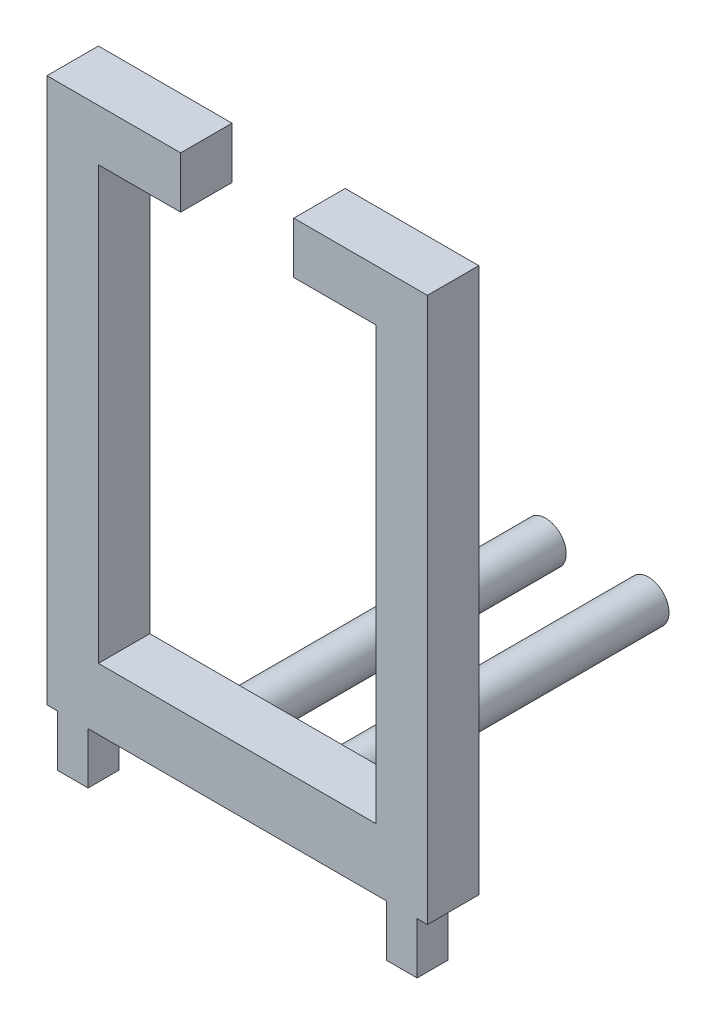
ISO-10303-21;
HEADER;
FILE_DESCRIPTION(('STEP AP214'),'2;1');
FILE_NAME('part.step','',(''),(''),'','','');
FILE_SCHEMA(('AUTOMOTIVE_DESIGN { 1 0 10303 214 1 1 1 1 }'));
ENDSEC;
DATA;
#1=APPLICATION_CONTEXT('core data for automotive mechanical design processes');
#2=APPLICATION_PROTOCOL_DEFINITION('international standard','automotive_design',2000,#1);
#3=PRODUCT_CONTEXT('',#1,'mechanical');
#4=PRODUCT('Part','Part','',(#3));
#5=PRODUCT_RELATED_PRODUCT_CATEGORY('part','',(#4));
#6=PRODUCT_DEFINITION_FORMATION('','',#4);
#7=PRODUCT_DEFINITION_CONTEXT('part definition',#1,'design');
#8=PRODUCT_DEFINITION('design','',#6,#7);
#9=PRODUCT_DEFINITION_SHAPE('','',#8);
#10=(LENGTH_UNIT() NAMED_UNIT(*) SI_UNIT(.MILLI.,.METRE.));
#11=(NAMED_UNIT(*) PLANE_ANGLE_UNIT() SI_UNIT($,.RADIAN.));
#12=(NAMED_UNIT(*) SI_UNIT($,.STERADIAN.) SOLID_ANGLE_UNIT());
#13=UNCERTAINTY_MEASURE_WITH_UNIT(LENGTH_MEASURE(1.E-05),#10,'distance_accuracy_value','');
#14=(GEOMETRIC_REPRESENTATION_CONTEXT(3) GLOBAL_UNCERTAINTY_ASSIGNED_CONTEXT((#13)) GLOBAL_UNIT_ASSIGNED_CONTEXT((#10,
#11,#12)) REPRESENTATION_CONTEXT('',''));
#15=CARTESIAN_POINT('',(0.,0.,0.));
#16=DIRECTION('',(0.,0.,1.));
#17=DIRECTION('',(1.,0.,0.));
#18=AXIS2_PLACEMENT_3D('',#15,#16,#17);
#19=CARTESIAN_POINT('',(-272.150432080713,58.,31.6586420954111));
#20=DIRECTION('',(1.,0.,0.));
#21=DIRECTION('',(0.,0.,-1.));
#22=AXIS2_PLACEMENT_3D('',#19,#20,#21);
#23=PLANE('',#22);
#24=DIRECTION('',(0.,0.,1.));
#25=VECTOR('',#24,1.);
#26=CARTESIAN_POINT('',(-272.150432080713,53.,31.6586420954111));
#27=LINE('',#26,#25);
#28=CARTESIAN_POINT('',(-272.150432080713,53.,26.6586420954111));
#29=VERTEX_POINT('',#28);
#30=CARTESIAN_POINT('',(-272.150432080713,53.,31.6586420954111));
#31=VERTEX_POINT('',#30);
#32=EDGE_CURVE('E197',#29,#31,#27,.T.);
#33=ORIENTED_EDGE('',*,*,#32,.F.);
#34=DIRECTION('',(0.,-1.,0.));
#35=VECTOR('',#34,1.);
#36=CARTESIAN_POINT('',(-272.150432080713,58.,26.6586420954111));
#37=LINE('',#36,#35);
#38=CARTESIAN_POINT('',(-272.150432080713,11.,26.6586420954111));
#39=VERTEX_POINT('',#38);
#40=EDGE_CURVE('E201',#29,#39,#37,.T.);
#41=ORIENTED_EDGE('',*,*,#40,.T.);
#42=DIRECTION('',(0.,0.,1.));
#43=VECTOR('',#42,1.);
#44=CARTESIAN_POINT('',(-272.150432080713,11.,31.6586420954111));
#45=LINE('',#44,#43);
#46=CARTESIAN_POINT('',(-272.150432080713,11.,31.6586420954111));
#47=VERTEX_POINT('',#46);
#48=EDGE_CURVE('E235',#39,#47,#45,.T.);
#49=ORIENTED_EDGE('',*,*,#48,.T.);
#50=DIRECTION('',(0.,-1.,0.));
#51=VECTOR('',#50,1.);
#52=CARTESIAN_POINT('',(-272.150432080713,58.,31.6586420954111));
#53=LINE('',#52,#51);
#54=EDGE_CURVE('E244',#31,#47,#53,.T.);
#55=ORIENTED_EDGE('',*,*,#54,.F.);
#56=EDGE_LOOP('',(#33,#41,#49,#55));
#57=FACE_BOUND('',#56,.T.);
#58=ADVANCED_FACE('F37',(#57),#23,.F.);
#59=CARTESIAN_POINT('',(-299.150432080713,58.,26.6586420954111));
#60=DIRECTION('',(-1.,0.,0.));
#61=DIRECTION('',(0.,0.,1.));
#62=AXIS2_PLACEMENT_3D('',#59,#60,#61);
#63=PLANE('',#62);
#64=DIRECTION('',(0.,0.,-1.));
#65=VECTOR('',#64,1.);
#66=CARTESIAN_POINT('',(-299.150432080713,53.,26.6586420954111));
#67=LINE('',#66,#65);
#68=CARTESIAN_POINT('',(-299.150432080713,53.,31.6586420954111));
#69=VERTEX_POINT('',#68);
#70=CARTESIAN_POINT('',(-299.150432080713,53.,26.6586420954111));
#71=VERTEX_POINT('',#70);
#72=EDGE_CURVE('E202',#69,#71,#67,.T.);
#73=ORIENTED_EDGE('',*,*,#72,.F.);
#74=DIRECTION('',(0.,-1.,0.));
#75=VECTOR('',#74,1.);
#76=CARTESIAN_POINT('',(-299.150432080713,58.,31.6586420954111));
#77=LINE('',#76,#75);
#78=CARTESIAN_POINT('',(-299.150432080713,11.,31.6586420954111));
#79=VERTEX_POINT('',#78);
#80=EDGE_CURVE('E52',#69,#79,#77,.T.);
#81=ORIENTED_EDGE('',*,*,#80,.T.);
#82=DIRECTION('',(0.,0.,-1.));
#83=VECTOR('',#82,1.);
#84=CARTESIAN_POINT('',(-299.150432080713,11.,26.6586420954111));
#85=LINE('',#84,#83);
#86=CARTESIAN_POINT('',(-299.150432080713,11.,26.6586420954111));
#87=VERTEX_POINT('',#86);
#88=EDGE_CURVE('E223',#79,#87,#85,.T.);
#89=ORIENTED_EDGE('',*,*,#88,.T.);
#90=DIRECTION('',(0.,-1.,0.));
#91=VECTOR('',#90,1.);
#92=CARTESIAN_POINT('',(-299.150432080713,58.,26.6586420954111));
#93=LINE('',#92,#91);
#94=EDGE_CURVE('E60',#71,#87,#93,.T.);
#95=ORIENTED_EDGE('',*,*,#94,.F.);
#96=EDGE_LOOP('',(#73,#81,#89,#95));
#97=FACE_BOUND('',#96,.T.);
#98=ADVANCED_FACE('F365',(#97),#63,.F.);
#99=CARTESIAN_POINT('',(0.,11.,0.));
#100=DIRECTION('',(0.,-1.,0.));
#101=DIRECTION('',(0.,0.,-1.));
#102=AXIS2_PLACEMENT_3D('',#99,#100,#101);
#103=PLANE('',#102);
#104=ORIENTED_EDGE('',*,*,#88,.F.);
#105=DIRECTION('',(1.,0.,0.));
#106=VECTOR('',#105,1.);
#107=CARTESIAN_POINT('',(-299.150432080713,11.,31.6586420954111));
#108=LINE('',#107,#106);
#109=EDGE_CURVE('E293',#79,#47,#108,.T.);
#110=ORIENTED_EDGE('',*,*,#109,.T.);
#111=ORIENTED_EDGE('',*,*,#48,.F.);
#112=DIRECTION('',(-1.,0.,0.));
#113=VECTOR('',#112,1.);
#114=CARTESIAN_POINT('',(-304.150432080713,11.,26.6586420954111));
#115=LINE('',#114,#113);
#116=EDGE_CURVE('E296',#39,#87,#115,.T.);
#117=ORIENTED_EDGE('',*,*,#116,.T.);
#118=EDGE_LOOP('',(#104,#110,#111,#117));
#119=FACE_BOUND('',#118,.T.);
#120=ADVANCED_FACE('F371',(#119),#103,.F.);
#121=CARTESIAN_POINT('',(0.,5.,0.));
#122=DIRECTION('',(0.,-1.,0.));
#123=DIRECTION('',(0.,0.,-1.));
#124=AXIS2_PLACEMENT_3D('',#121,#122,#123);
#125=PLANE('',#124);
#126=DIRECTION('',(0.,0.,1.));
#127=VECTOR('',#126,1.);
#128=CARTESIAN_POINT('',(-304.150432080713,5.,31.6586420954111));
#129=LINE('',#128,#127);
#130=CARTESIAN_POINT('',(-304.150432080713,5.,26.6586420954111));
#131=VERTEX_POINT('',#130);
#132=CARTESIAN_POINT('',(-304.150432080713,5.,31.6586420954111));
#133=VERTEX_POINT('',#132);
#134=EDGE_CURVE('E291',#131,#133,#129,.T.);
#135=ORIENTED_EDGE('',*,*,#134,.F.);
#136=DIRECTION('',(-1.,0.,0.));
#137=VECTOR('',#136,1.);
#138=CARTESIAN_POINT('',(-304.150432080713,5.,26.6586420954111));
#139=LINE('',#138,#137);
#140=CARTESIAN_POINT('',(-267.150432080713,5.,26.6586420954111));
#141=VERTEX_POINT('',#140);
#142=EDGE_CURVE('E297',#141,#131,#139,.T.);
#143=ORIENTED_EDGE('',*,*,#142,.F.);
#144=DIRECTION('',(0.,0.,-1.));
#145=VECTOR('',#144,1.);
#146=CARTESIAN_POINT('',(-267.150432080713,5.,26.6586420954111));
#147=LINE('',#146,#145);
#148=CARTESIAN_POINT('',(-267.150432080713,5.,31.6586420954111));
#149=VERTEX_POINT('',#148);
#150=EDGE_CURVE('E285',#149,#141,#147,.T.);
#151=ORIENTED_EDGE('',*,*,#150,.F.);
#152=DIRECTION('',(1.,0.,0.));
#153=VECTOR('',#152,1.);
#154=CARTESIAN_POINT('',(-299.150432080713,5.,31.6586420954111));
#155=LINE('',#154,#153);
#156=CARTESIAN_POINT('',(-268.150432080713,5.,31.6586420954111));
#157=VERTEX_POINT('',#156);
#158=EDGE_CURVE('E302',#157,#149,#155,.T.);
#159=ORIENTED_EDGE('',*,*,#158,.F.);
#160=DIRECTION('',(0.,0.,-1.));
#161=VECTOR('',#160,1.);
#162=CARTESIAN_POINT('',(-268.150432080713,5.,28.6586420954111));
#163=LINE('',#162,#161);
#164=CARTESIAN_POINT('',(-268.150432080713,5.,28.6586420954111));
#165=VERTEX_POINT('',#164);
#166=EDGE_CURVE('E259',#157,#165,#163,.T.);
#167=ORIENTED_EDGE('',*,*,#166,.T.);
#168=DIRECTION('',(-1.,0.,0.));
#169=VECTOR('',#168,1.);
#170=CARTESIAN_POINT('',(-271.150432080713,5.,28.6586420954111));
#171=LINE('',#170,#169);
#172=CARTESIAN_POINT('',(-271.150432080713,5.,28.6586420954111));
#173=VERTEX_POINT('',#172);
#174=EDGE_CURVE('E263',#165,#173,#171,.T.);
#175=ORIENTED_EDGE('',*,*,#174,.T.);
#176=DIRECTION('',(0.,0.,1.));
#177=VECTOR('',#176,1.);
#178=CARTESIAN_POINT('',(-271.150432080713,5.,31.6586420954111));
#179=LINE('',#178,#177);
#180=CARTESIAN_POINT('',(-271.150432080713,5.,31.6586420954111));
#181=VERTEX_POINT('',#180);
#182=EDGE_CURVE('E256',#173,#181,#179,.T.);
#183=ORIENTED_EDGE('',*,*,#182,.T.);
#184=CARTESIAN_POINT('',(-300.150432080713,5.,31.6586420954111));
#185=VERTEX_POINT('',#184);
#186=EDGE_CURVE('E306',#185,#181,#155,.T.);
#187=ORIENTED_EDGE('',*,*,#186,.F.);
#188=DIRECTION('',(0.,0.,-1.));
#189=VECTOR('',#188,1.);
#190=CARTESIAN_POINT('',(-300.150432080713,5.,28.6586420954111));
#191=LINE('',#190,#189);
#192=CARTESIAN_POINT('',(-300.150432080713,5.,28.6586420954111));
#193=VERTEX_POINT('',#192);
#194=EDGE_CURVE('E314',#185,#193,#191,.T.);
#195=ORIENTED_EDGE('',*,*,#194,.T.);
#196=DIRECTION('',(-1.,0.,0.));
#197=VECTOR('',#196,1.);
#198=CARTESIAN_POINT('',(-303.150432080713,5.,28.6586420954111));
#199=LINE('',#198,#197);
#200=CARTESIAN_POINT('',(-303.150432080713,5.,28.6586420954111));
#201=VERTEX_POINT('',#200);
#202=EDGE_CURVE('E317',#193,#201,#199,.T.);
#203=ORIENTED_EDGE('',*,*,#202,.T.);
#204=DIRECTION('',(0.,0.,1.));
#205=VECTOR('',#204,1.);
#206=CARTESIAN_POINT('',(-303.150432080713,5.,31.6586420954111));
#207=LINE('',#206,#205);
#208=CARTESIAN_POINT('',(-303.150432080713,5.,31.6586420954111));
#209=VERTEX_POINT('',#208);
#210=EDGE_CURVE('E321',#201,#209,#207,.T.);
#211=ORIENTED_EDGE('',*,*,#210,.T.);
#212=EDGE_CURVE('E303',#133,#209,#155,.T.);
#213=ORIENTED_EDGE('',*,*,#212,.F.);
#214=EDGE_LOOP('',(#135,#143,#151,#159,#167,#175,#183,#187,#195,#203,#211,#213));
#215=FACE_BOUND('',#214,.T.);
#216=ADVANCED_FACE('F407',(#215),#125,.T.);
#217=CARTESIAN_POINT('',(-300.150432080713,5.,31.6586420954111));
#218=DIRECTION('',(0.,0.,-1.));
#219=DIRECTION('',(-1.,0.,0.));
#220=AXIS2_PLACEMENT_3D('',#217,#218,#219);
#221=PLANE('',#220);
#222=DIRECTION('',(0.,1.,0.));
#223=VECTOR('',#222,1.);
#224=CARTESIAN_POINT('',(-267.150432080713,5.,31.6586420954111));
#225=LINE('',#224,#223);
#226=CARTESIAN_POINT('',(-267.150432080713,58.,31.6586420954111));
#227=VERTEX_POINT('',#226);
#228=EDGE_CURVE('E288',#149,#227,#225,.T.);
#229=ORIENTED_EDGE('',*,*,#228,.T.);
#230=DIRECTION('',(1.,0.,0.));
#231=VECTOR('',#230,1.);
#232=CARTESIAN_POINT('',(-267.150432080713,58.,31.6586420954111));
#233=LINE('',#232,#231);
#234=CARTESIAN_POINT('',(-280.150432080713,58.,31.6586420954111));
#235=VERTEX_POINT('',#234);
#236=EDGE_CURVE('E238',#235,#227,#233,.T.);
#237=ORIENTED_EDGE('',*,*,#236,.F.);
#238=DIRECTION('',(0.,1.,0.));
#239=VECTOR('',#238,1.);
#240=CARTESIAN_POINT('',(-280.150432080713,58.,31.6586420954111));
#241=LINE('',#240,#239);
#242=CARTESIAN_POINT('',(-280.150432080713,53.,31.6586420954111));
#243=VERTEX_POINT('',#242);
#244=EDGE_CURVE('E188',#243,#235,#241,.T.);
#245=ORIENTED_EDGE('',*,*,#244,.F.);
#246=DIRECTION('',(1.,0.,0.));
#247=VECTOR('',#246,1.);
#248=CARTESIAN_POINT('',(-280.150432080713,53.,31.6586420954111));
#249=LINE('',#248,#247);
#250=EDGE_CURVE('E184',#243,#31,#249,.T.);
#251=ORIENTED_EDGE('',*,*,#250,.T.);
#252=ORIENTED_EDGE('',*,*,#54,.T.);
#253=ORIENTED_EDGE('',*,*,#109,.F.);
#254=ORIENTED_EDGE('',*,*,#80,.F.);
#255=DIRECTION('',(-1.,0.,0.));
#256=VECTOR('',#255,1.);
#257=CARTESIAN_POINT('',(-291.150432080713,53.,31.6586420954111));
#258=LINE('',#257,#256);
#259=CARTESIAN_POINT('',(-291.150432080713,53.,31.6586420954111));
#260=VERTEX_POINT('',#259);
#261=EDGE_CURVE('E221',#260,#69,#258,.T.);
#262=ORIENTED_EDGE('',*,*,#261,.F.);
#263=DIRECTION('',(0.,-1.,0.));
#264=VECTOR('',#263,1.);
#265=CARTESIAN_POINT('',(-291.150432080713,53.,31.6586420954111));
#266=LINE('',#265,#264);
#267=CARTESIAN_POINT('',(-291.150432080713,58.,31.6586420954111));
#268=VERTEX_POINT('',#267);
#269=EDGE_CURVE('E204',#268,#260,#266,.T.);
#270=ORIENTED_EDGE('',*,*,#269,.F.);
#271=DIRECTION('',(1.,0.,0.));
#272=VECTOR('',#271,1.);
#273=CARTESIAN_POINT('',(-299.150432080713,58.,31.6586420954111));
#274=LINE('',#273,#272);
#275=CARTESIAN_POINT('',(-304.150432080713,58.,31.6586420954111));
#276=VERTEX_POINT('',#275);
#277=EDGE_CURVE('E227',#276,#268,#274,.T.);
#278=ORIENTED_EDGE('',*,*,#277,.F.);
#279=DIRECTION('',(0.,-1.,0.));
#280=VECTOR('',#279,1.);
#281=CARTESIAN_POINT('',(-304.150432080713,11.,31.6586420954111));
#282=LINE('',#281,#280);
#283=EDGE_CURVE('E310',#276,#133,#282,.T.);
#284=ORIENTED_EDGE('',*,*,#283,.T.);
#285=ORIENTED_EDGE('',*,*,#212,.T.);
#286=DIRECTION('',(0.,-1.,0.));
#287=VECTOR('',#286,1.);
#288=CARTESIAN_POINT('',(-303.150432080713,5.,31.6586420954111));
#289=LINE('',#288,#287);
#290=CARTESIAN_POINT('',(-303.150432080713,0.,31.6586420954111));
#291=VERTEX_POINT('',#290);
#292=EDGE_CURVE('E324',#209,#291,#289,.T.);
#293=ORIENTED_EDGE('',*,*,#292,.T.);
#294=DIRECTION('',(1.,0.,0.));
#295=VECTOR('',#294,1.);
#296=CARTESIAN_POINT('',(-300.150432080713,0.,31.6586420954111));
#297=LINE('',#296,#295);
#298=CARTESIAN_POINT('',(-300.150432080713,0.,31.6586420954111));
#299=VERTEX_POINT('',#298);
#300=EDGE_CURVE('E313',#291,#299,#297,.T.);
#301=ORIENTED_EDGE('',*,*,#300,.T.);
#302=DIRECTION('',(0.,-1.,0.));
#303=VECTOR('',#302,1.);
#304=CARTESIAN_POINT('',(-300.150432080713,5.,31.6586420954111));
#305=LINE('',#304,#303);
#306=EDGE_CURVE('E340',#185,#299,#305,.T.);
#307=ORIENTED_EDGE('',*,*,#306,.F.);
#308=ORIENTED_EDGE('',*,*,#186,.T.);
#309=DIRECTION('',(0.,-1.,0.));
#310=VECTOR('',#309,1.);
#311=CARTESIAN_POINT('',(-271.150432080713,5.,31.6586420954111));
#312=LINE('',#311,#310);
#313=CARTESIAN_POINT('',(-271.150432080713,0.,31.6586420954111));
#314=VERTEX_POINT('',#313);
#315=EDGE_CURVE('E282',#181,#314,#312,.T.);
#316=ORIENTED_EDGE('',*,*,#315,.T.);
#317=DIRECTION('',(1.,0.,0.));
#318=VECTOR('',#317,1.);
#319=CARTESIAN_POINT('',(-268.150432080713,0.,31.6586420954111));
#320=LINE('',#319,#318);
#321=CARTESIAN_POINT('',(-268.150432080713,0.,31.6586420954111));
#322=VERTEX_POINT('',#321);
#323=EDGE_CURVE('E269',#314,#322,#320,.T.);
#324=ORIENTED_EDGE('',*,*,#323,.T.);
#325=DIRECTION('',(0.,-1.,0.));
#326=VECTOR('',#325,1.);
#327=CARTESIAN_POINT('',(-268.150432080713,5.,31.6586420954111));
#328=LINE('',#327,#326);
#329=EDGE_CURVE('E279',#157,#322,#328,.T.);
#330=ORIENTED_EDGE('',*,*,#329,.F.);
#331=ORIENTED_EDGE('',*,*,#158,.T.);
#332=EDGE_LOOP('',(#229,#237,#245,#251,#252,#253,#254,#262,#270,#278,#284,#285,#293,#301,#307,
#308,#316,#324,#330,#331));
#333=FACE_BOUND('',#332,.T.);
#334=ADVANCED_FACE('F39',(#333),#221,.F.);
#335=CARTESIAN_POINT('',(-300.150432080713,5.,28.6586420954111));
#336=DIRECTION('',(-1.,0.,0.));
#337=DIRECTION('',(0.,0.,1.));
#338=AXIS2_PLACEMENT_3D('',#335,#336,#337);
#339=PLANE('',#338);
#340=DIRECTION('',(0.,0.,-1.));
#341=VECTOR('',#340,1.);
#342=CARTESIAN_POINT('',(-300.150432080713,0.,28.6586420954111));
#343=LINE('',#342,#341);
#344=CARTESIAN_POINT('',(-300.150432080713,0.,28.6586420954111));
#345=VERTEX_POINT('',#344);
#346=EDGE_CURVE('E327',#299,#345,#343,.T.);
#347=ORIENTED_EDGE('',*,*,#346,.T.);
#348=DIRECTION('',(0.,-1.,0.));
#349=VECTOR('',#348,1.);
#350=CARTESIAN_POINT('',(-300.150432080713,5.,28.6586420954111));
#351=LINE('',#350,#349);
#352=EDGE_CURVE('E337',#193,#345,#351,.T.);
#353=ORIENTED_EDGE('',*,*,#352,.F.);
#354=ORIENTED_EDGE('',*,*,#194,.F.);
#355=ORIENTED_EDGE('',*,*,#306,.T.);
#356=EDGE_LOOP('',(#347,#353,#354,#355));
#357=FACE_BOUND('',#356,.T.);
#358=ADVANCED_FACE('F414',(#357),#339,.F.);
#359=CARTESIAN_POINT('',(-303.150432080713,5.,28.6586420954111));
#360=DIRECTION('',(0.,0.,1.));
#361=DIRECTION('',(1.,0.,0.));
#362=AXIS2_PLACEMENT_3D('',#359,#360,#361);
#363=PLANE('',#362);
#364=DIRECTION('',(-1.,0.,0.));
#365=VECTOR('',#364,1.);
#366=CARTESIAN_POINT('',(-303.150432080713,0.,28.6586420954111));
#367=LINE('',#366,#365);
#368=CARTESIAN_POINT('',(-303.150432080713,0.,28.6586420954111));
#369=VERTEX_POINT('',#368);
#370=EDGE_CURVE('E329',#345,#369,#367,.T.);
#371=ORIENTED_EDGE('',*,*,#370,.T.);
#372=DIRECTION('',(0.,-1.,0.));
#373=VECTOR('',#372,1.);
#374=CARTESIAN_POINT('',(-303.150432080713,5.,28.6586420954111));
#375=LINE('',#374,#373);
#376=EDGE_CURVE('E334',#201,#369,#375,.T.);
#377=ORIENTED_EDGE('',*,*,#376,.F.);
#378=ORIENTED_EDGE('',*,*,#202,.F.);
#379=ORIENTED_EDGE('',*,*,#352,.T.);
#380=EDGE_LOOP('',(#371,#377,#378,#379));
#381=FACE_BOUND('',#380,.T.);
#382=ADVANCED_FACE('F454',(#381),#363,.F.);
#383=CARTESIAN_POINT('',(-303.150432080713,5.,31.6586420954111));
#384=DIRECTION('',(1.,0.,0.));
#385=DIRECTION('',(0.,0.,-1.));
#386=AXIS2_PLACEMENT_3D('',#383,#384,#385);
#387=PLANE('',#386);
#388=DIRECTION('',(0.,0.,1.));
#389=VECTOR('',#388,1.);
#390=CARTESIAN_POINT('',(-303.150432080713,0.,31.6586420954111));
#391=LINE('',#390,#389);
#392=EDGE_CURVE('E318',#369,#291,#391,.T.);
#393=ORIENTED_EDGE('',*,*,#392,.T.);
#394=ORIENTED_EDGE('',*,*,#292,.F.);
#395=ORIENTED_EDGE('',*,*,#210,.F.);
#396=ORIENTED_EDGE('',*,*,#376,.T.);
#397=EDGE_LOOP('',(#393,#394,#395,#396));
#398=FACE_BOUND('',#397,.T.);
#399=ADVANCED_FACE('F458',(#398),#387,.F.);
#400=CARTESIAN_POINT('',(0.,0.,0.));
#401=DIRECTION('',(0.,-1.,0.));
#402=DIRECTION('',(0.,0.,-1.));
#403=AXIS2_PLACEMENT_3D('',#400,#401,#402);
#404=PLANE('',#403);
#405=ORIENTED_EDGE('',*,*,#300,.F.);
#406=ORIENTED_EDGE('',*,*,#392,.F.);
#407=ORIENTED_EDGE('',*,*,#370,.F.);
#408=ORIENTED_EDGE('',*,*,#346,.F.);
#409=EDGE_LOOP('',(#405,#406,#407,#408));
#410=FACE_BOUND('',#409,.T.);
#411=ADVANCED_FACE('F359',(#410),#404,.T.);
#412=CARTESIAN_POINT('',(-304.150432080713,11.,31.6586420954111));
#413=DIRECTION('',(1.,0.,0.));
#414=DIRECTION('',(0.,0.,-1.));
#415=AXIS2_PLACEMENT_3D('',#412,#413,#414);
#416=PLANE('',#415);
#417=ORIENTED_EDGE('',*,*,#134,.T.);
#418=ORIENTED_EDGE('',*,*,#283,.F.);
#419=DIRECTION('',(0.,0.,1.));
#420=VECTOR('',#419,1.);
#421=CARTESIAN_POINT('',(-304.150432080713,58.,31.6586420954111));
#422=LINE('',#421,#420);
#423=CARTESIAN_POINT('',(-304.150432080713,58.,26.6586420954111));
#424=VERTEX_POINT('',#423);
#425=EDGE_CURVE('E224',#424,#276,#422,.T.);
#426=ORIENTED_EDGE('',*,*,#425,.F.);
#427=DIRECTION('',(0.,-1.,0.));
#428=VECTOR('',#427,1.);
#429=CARTESIAN_POINT('',(-304.150432080713,11.,26.6586420954111));
#430=LINE('',#429,#428);
#431=EDGE_CURVE('E299',#424,#131,#430,.T.);
#432=ORIENTED_EDGE('',*,*,#431,.T.);
#433=EDGE_LOOP('',(#417,#418,#426,#432));
#434=FACE_BOUND('',#433,.T.);
#435=ADVANCED_FACE('F349',(#434),#416,.F.);
#436=CARTESIAN_POINT('',(-304.150432080713,11.,26.6586420954111));
#437=DIRECTION('',(0.,0.,1.));
#438=DIRECTION('',(1.,0.,0.));
#439=AXIS2_PLACEMENT_3D('',#436,#437,#438);
#440=PLANE('',#439);
#441=CARTESIAN_POINT('',(-290.650393331086,7.98031511318751,26.6586420954111));
#442=DIRECTION('',(0.,0.,1.));
#443=DIRECTION('',(1.,0.,0.));
#444=AXIS2_PLACEMENT_3D('',#441,#442,#443);
#445=CIRCLE('',#444,2.);
#446=CARTESIAN_POINT('',(-288.650393331086,7.98031511318751,26.6586420954111));
#447=VERTEX_POINT('',#446);
#448=EDGE_CURVE('E11',#447,#447,#445,.F.);
#449=ORIENTED_EDGE('',*,*,#448,.F.);
#450=EDGE_LOOP('',(#449));
#451=FACE_BOUND('',#450,.T.);
#452=CARTESIAN_POINT('',(-280.65047083034,8.01968488681249,26.6586420954111));
#453=DIRECTION('',(0.,0.,1.));
#454=DIRECTION('',(1.,0.,0.));
#455=AXIS2_PLACEMENT_3D('',#452,#453,#454);
#456=CIRCLE('',#455,2.);
#457=CARTESIAN_POINT('',(-278.65047083034,8.01968488681249,26.6586420954111));
#458=VERTEX_POINT('',#457);
#459=EDGE_CURVE('E45',#458,#458,#456,.F.);
#460=ORIENTED_EDGE('',*,*,#459,.F.);
#461=EDGE_LOOP('',(#460));
#462=FACE_BOUND('',#461,.T.);
#463=ORIENTED_EDGE('',*,*,#142,.T.);
#464=ORIENTED_EDGE('',*,*,#431,.F.);
#465=DIRECTION('',(-1.,0.,0.));
#466=VECTOR('',#465,1.);
#467=CARTESIAN_POINT('',(-304.150432080713,58.,26.6586420954111));
#468=LINE('',#467,#466);
#469=CARTESIAN_POINT('',(-291.150432080713,58.,26.6586420954111));
#470=VERTEX_POINT('',#469);
#471=EDGE_CURVE('E229',#470,#424,#468,.T.);
#472=ORIENTED_EDGE('',*,*,#471,.F.);
#473=DIRECTION('',(0.,1.,0.));
#474=VECTOR('',#473,1.);
#475=CARTESIAN_POINT('',(-291.150432080713,58.,26.6586420954111));
#476=LINE('',#475,#474);
#477=CARTESIAN_POINT('',(-291.150432080713,53.,26.6586420954111));
#478=VERTEX_POINT('',#477);
#479=EDGE_CURVE('E213',#478,#470,#476,.T.);
#480=ORIENTED_EDGE('',*,*,#479,.F.);
#481=DIRECTION('',(-1.,0.,0.));
#482=VECTOR('',#481,1.);
#483=CARTESIAN_POINT('',(-291.150432080713,53.,26.6586420954111));
#484=LINE('',#483,#482);
#485=EDGE_CURVE('E218',#478,#71,#484,.T.);
#486=ORIENTED_EDGE('',*,*,#485,.T.);
#487=ORIENTED_EDGE('',*,*,#94,.T.);
#488=ORIENTED_EDGE('',*,*,#116,.F.);
#489=ORIENTED_EDGE('',*,*,#40,.F.);
#490=DIRECTION('',(1.,0.,0.));
#491=VECTOR('',#490,1.);
#492=CARTESIAN_POINT('',(-280.150432080713,53.,26.6586420954111));
#493=LINE('',#492,#491);
#494=CARTESIAN_POINT('',(-280.150432080713,53.,26.6586420954111));
#495=VERTEX_POINT('',#494);
#496=EDGE_CURVE('E181',#495,#29,#493,.T.);
#497=ORIENTED_EDGE('',*,*,#496,.F.);
#498=DIRECTION('',(0.,-1.,0.));
#499=VECTOR('',#498,1.);
#500=CARTESIAN_POINT('',(-280.150432080713,53.,26.6586420954111));
#501=LINE('',#500,#499);
#502=CARTESIAN_POINT('',(-280.150432080713,58.,26.6586420954111));
#503=VERTEX_POINT('',#502);
#504=EDGE_CURVE('E189',#503,#495,#501,.T.);
#505=ORIENTED_EDGE('',*,*,#504,.F.);
#506=DIRECTION('',(-1.,0.,0.));
#507=VECTOR('',#506,1.);
#508=CARTESIAN_POINT('',(-272.150432080713,58.,26.6586420954111));
#509=LINE('',#508,#507);
#510=CARTESIAN_POINT('',(-267.150432080713,58.,26.6586420954111));
#511=VERTEX_POINT('',#510);
#512=EDGE_CURVE('E236',#511,#503,#509,.T.);
#513=ORIENTED_EDGE('',*,*,#512,.F.);
#514=DIRECTION('',(0.,1.,0.));
#515=VECTOR('',#514,1.);
#516=CARTESIAN_POINT('',(-267.150432080713,5.,26.6586420954111));
#517=LINE('',#516,#515);
#518=EDGE_CURVE('E289',#141,#511,#517,.T.);
#519=ORIENTED_EDGE('',*,*,#518,.F.);
#520=EDGE_LOOP('',(#463,#464,#472,#480,#486,#487,#488,#489,#497,#505,#513,#519));
#521=FACE_BOUND('',#520,.T.);
#522=ADVANCED_FACE('F200',(#451,#462,#521),#440,.F.);
#523=CARTESIAN_POINT('',(-267.150432080713,5.,26.6586420954111));
#524=DIRECTION('',(1.,0.,0.));
#525=DIRECTION('',(0.,0.,-1.));
#526=AXIS2_PLACEMENT_3D('',#523,#524,#525);
#527=PLANE('',#526);
#528=ORIENTED_EDGE('',*,*,#518,.T.);
#529=DIRECTION('',(0.,0.,-1.));
#530=VECTOR('',#529,1.);
#531=CARTESIAN_POINT('',(-267.150432080713,58.,26.6586420954111));
#532=LINE('',#531,#530);
#533=EDGE_CURVE('E241',#227,#511,#532,.T.);
#534=ORIENTED_EDGE('',*,*,#533,.F.);
#535=ORIENTED_EDGE('',*,*,#228,.F.);
#536=ORIENTED_EDGE('',*,*,#150,.T.);
#537=EDGE_LOOP('',(#528,#534,#535,#536));
#538=FACE_BOUND('',#537,.T.);
#539=ADVANCED_FACE('F348',(#538),#527,.T.);
#540=CARTESIAN_POINT('',(-271.150432080713,5.,31.6586420954111));
#541=DIRECTION('',(1.,0.,0.));
#542=DIRECTION('',(0.,0.,-1.));
#543=AXIS2_PLACEMENT_3D('',#540,#541,#542);
#544=PLANE('',#543);
#545=DIRECTION('',(0.,0.,1.));
#546=VECTOR('',#545,1.);
#547=CARTESIAN_POINT('',(-271.150432080713,0.,31.6586420954111));
#548=LINE('',#547,#546);
#549=CARTESIAN_POINT('',(-271.150432080713,0.,28.6586420954111));
#550=VERTEX_POINT('',#549);
#551=EDGE_CURVE('E255',#550,#314,#548,.T.);
#552=ORIENTED_EDGE('',*,*,#551,.T.);
#553=ORIENTED_EDGE('',*,*,#315,.F.);
#554=ORIENTED_EDGE('',*,*,#182,.F.);
#555=DIRECTION('',(0.,-1.,0.));
#556=VECTOR('',#555,1.);
#557=CARTESIAN_POINT('',(-271.150432080713,5.,28.6586420954111));
#558=LINE('',#557,#556);
#559=EDGE_CURVE('E266',#173,#550,#558,.T.);
#560=ORIENTED_EDGE('',*,*,#559,.T.);
#561=EDGE_LOOP('',(#552,#553,#554,#560));
#562=FACE_BOUND('',#561,.T.);
#563=ADVANCED_FACE('F356',(#562),#544,.F.);
#564=CARTESIAN_POINT('',(-268.150432080713,5.,28.6586420954111));
#565=DIRECTION('',(-1.,0.,0.));
#566=DIRECTION('',(0.,0.,1.));
#567=AXIS2_PLACEMENT_3D('',#564,#565,#566);
#568=PLANE('',#567);
#569=DIRECTION('',(0.,0.,-1.));
#570=VECTOR('',#569,1.);
#571=CARTESIAN_POINT('',(-268.150432080713,0.,28.6586420954111));
#572=LINE('',#571,#570);
#573=CARTESIAN_POINT('',(-268.150432080713,0.,28.6586420954111));
#574=VERTEX_POINT('',#573);
#575=EDGE_CURVE('E271',#322,#574,#572,.T.);
#576=ORIENTED_EDGE('',*,*,#575,.T.);
#577=DIRECTION('',(0.,-1.,0.));
#578=VECTOR('',#577,1.);
#579=CARTESIAN_POINT('',(-268.150432080713,5.,28.6586420954111));
#580=LINE('',#579,#578);
#581=EDGE_CURVE('E276',#165,#574,#580,.T.);
#582=ORIENTED_EDGE('',*,*,#581,.F.);
#583=ORIENTED_EDGE('',*,*,#166,.F.);
#584=ORIENTED_EDGE('',*,*,#329,.T.);
#585=EDGE_LOOP('',(#576,#582,#583,#584));
#586=FACE_BOUND('',#585,.T.);
#587=ADVANCED_FACE('F398',(#586),#568,.F.);
#588=CARTESIAN_POINT('',(-271.150432080713,5.,28.6586420954111));
#589=DIRECTION('',(0.,0.,1.));
#590=DIRECTION('',(1.,0.,0.));
#591=AXIS2_PLACEMENT_3D('',#588,#589,#590);
#592=PLANE('',#591);
#593=DIRECTION('',(-1.,0.,0.));
#594=VECTOR('',#593,1.);
#595=CARTESIAN_POINT('',(-271.150432080713,0.,28.6586420954111));
#596=LINE('',#595,#594);
#597=EDGE_CURVE('E260',#574,#550,#596,.T.);
#598=ORIENTED_EDGE('',*,*,#597,.T.);
#599=ORIENTED_EDGE('',*,*,#559,.F.);
#600=ORIENTED_EDGE('',*,*,#174,.F.);
#601=ORIENTED_EDGE('',*,*,#581,.T.);
#602=EDGE_LOOP('',(#598,#599,#600,#601));
#603=FACE_BOUND('',#602,.T.);
#604=ADVANCED_FACE('F394',(#603),#592,.F.);
#605=CARTESIAN_POINT('',(0.,0.,0.));
#606=DIRECTION('',(0.,-1.,0.));
#607=DIRECTION('',(0.,0.,-1.));
#608=AXIS2_PLACEMENT_3D('',#605,#606,#607);
#609=PLANE('',#608);
#610=ORIENTED_EDGE('',*,*,#551,.F.);
#611=ORIENTED_EDGE('',*,*,#597,.F.);
#612=ORIENTED_EDGE('',*,*,#575,.F.);
#613=ORIENTED_EDGE('',*,*,#323,.F.);
#614=EDGE_LOOP('',(#610,#611,#612,#613));
#615=FACE_BOUND('',#614,.T.);
#616=ADVANCED_FACE('F390',(#615),#609,.T.);
#617=CARTESIAN_POINT('',(-280.65047083034,8.01968488681249,-3.34135790458889));
#618=DIRECTION('',(0.,0.,1.));
#619=DIRECTION('',(1.,0.,0.));
#620=AXIS2_PLACEMENT_3D('',#617,#618,#619);
#621=CYLINDRICAL_SURFACE('',#620,2.);
#622=CARTESIAN_POINT('',(-280.65047083034,8.01968488681249,-3.34135790458889));
#623=DIRECTION('',(0.,0.,-1.));
#624=DIRECTION('',(-1.,0.,0.));
#625=AXIS2_PLACEMENT_3D('',#622,#623,#624);
#626=CIRCLE('',#625,2.);
#627=CARTESIAN_POINT('',(-282.65047083034,8.01968488681249,-3.34135790458889));
#628=VERTEX_POINT('',#627);
#629=EDGE_CURVE('E252',#628,#628,#626,.T.);
#630=ORIENTED_EDGE('',*,*,#629,.F.);
#631=EDGE_LOOP('',(#630));
#632=FACE_BOUND('',#631,.T.);
#633=ORIENTED_EDGE('',*,*,#459,.T.);
#634=EDGE_LOOP('',(#633));
#635=FACE_BOUND('',#634,.T.);
#636=ADVANCED_FACE('F345',(#632,#635),#621,.T.);
#637=CARTESIAN_POINT('',(-280.65047083034,8.01968488681249,-3.34135790458889));
#638=DIRECTION('',(0.,0.,-1.));
#639=DIRECTION('',(-1.,0.,0.));
#640=AXIS2_PLACEMENT_3D('',#637,#638,#639);
#641=PLANE('',#640);
#642=ORIENTED_EDGE('',*,*,#629,.T.);
#643=EDGE_LOOP('',(#642));
#644=FACE_BOUND('',#643,.T.);
#645=ADVANCED_FACE('F383',(#644),#641,.T.);
#646=CARTESIAN_POINT('',(-290.650393331086,7.98031511318751,-3.34135790458889));
#647=DIRECTION('',(0.,0.,1.));
#648=DIRECTION('',(1.,0.,0.));
#649=AXIS2_PLACEMENT_3D('',#646,#647,#648);
#650=CYLINDRICAL_SURFACE('',#649,2.);
#651=CARTESIAN_POINT('',(-290.650393331086,7.98031511318751,-3.34135790458889));
#652=DIRECTION('',(0.,0.,-1.));
#653=DIRECTION('',(-1.,0.,0.));
#654=AXIS2_PLACEMENT_3D('',#651,#652,#653);
#655=CIRCLE('',#654,2.);
#656=CARTESIAN_POINT('',(-292.650393331086,7.98031511318751,-3.34135790458889));
#657=VERTEX_POINT('',#656);
#658=EDGE_CURVE('E249',#657,#657,#655,.T.);
#659=ORIENTED_EDGE('',*,*,#658,.F.);
#660=EDGE_LOOP('',(#659));
#661=FACE_BOUND('',#660,.T.);
#662=ORIENTED_EDGE('',*,*,#448,.T.);
#663=EDGE_LOOP('',(#662));
#664=FACE_BOUND('',#663,.T.);
#665=ADVANCED_FACE('F379',(#661,#664),#650,.T.);
#666=CARTESIAN_POINT('',(-290.650393331086,7.98031511318751,-3.34135790458889));
#667=DIRECTION('',(0.,0.,-1.));
#668=DIRECTION('',(-1.,0.,0.));
#669=AXIS2_PLACEMENT_3D('',#666,#667,#668);
#670=PLANE('',#669);
#671=ORIENTED_EDGE('',*,*,#658,.T.);
#672=EDGE_LOOP('',(#671));
#673=FACE_BOUND('',#672,.T.);
#674=ADVANCED_FACE('F376',(#673),#670,.T.);
#675=CARTESIAN_POINT('',(0.,58.,0.));
#676=DIRECTION('',(0.,-1.,0.));
#677=DIRECTION('',(0.,0.,-1.));
#678=AXIS2_PLACEMENT_3D('',#675,#676,#677);
#679=PLANE('',#678);
#680=ORIENTED_EDGE('',*,*,#512,.T.);
#681=DIRECTION('',(0.,0.,-1.));
#682=VECTOR('',#681,1.);
#683=CARTESIAN_POINT('',(-280.150432080713,58.,26.6586420954111));
#684=LINE('',#683,#682);
#685=EDGE_CURVE('E195',#235,#503,#684,.T.);
#686=ORIENTED_EDGE('',*,*,#685,.F.);
#687=ORIENTED_EDGE('',*,*,#236,.T.);
#688=ORIENTED_EDGE('',*,*,#533,.T.);
#689=EDGE_LOOP('',(#680,#686,#687,#688));
#690=FACE_BOUND('',#689,.T.);
#691=ADVANCED_FACE('F375',(#690),#679,.F.);
#692=CARTESIAN_POINT('',(0.,58.,0.));
#693=DIRECTION('',(0.,-1.,0.));
#694=DIRECTION('',(0.,0.,-1.));
#695=AXIS2_PLACEMENT_3D('',#692,#693,#694);
#696=PLANE('',#695);
#697=ORIENTED_EDGE('',*,*,#425,.T.);
#698=ORIENTED_EDGE('',*,*,#277,.T.);
#699=DIRECTION('',(0.,0.,1.));
#700=VECTOR('',#699,1.);
#701=CARTESIAN_POINT('',(-291.150432080713,58.,31.6586420954111));
#702=LINE('',#701,#700);
#703=EDGE_CURVE('E216',#470,#268,#702,.T.);
#704=ORIENTED_EDGE('',*,*,#703,.F.);
#705=ORIENTED_EDGE('',*,*,#471,.T.);
#706=EDGE_LOOP('',(#697,#698,#704,#705));
#707=FACE_BOUND('',#706,.T.);
#708=ADVANCED_FACE('F424',(#707),#696,.F.);
#709=CARTESIAN_POINT('',(-291.150432080713,53.,26.6586420954111));
#710=DIRECTION('',(0.,1.,0.));
#711=DIRECTION('',(0.,0.,1.));
#712=AXIS2_PLACEMENT_3D('',#709,#710,#711);
#713=PLANE('',#712);
#714=ORIENTED_EDGE('',*,*,#72,.T.);
#715=ORIENTED_EDGE('',*,*,#485,.F.);
#716=DIRECTION('',(0.,0.,-1.));
#717=VECTOR('',#716,1.);
#718=CARTESIAN_POINT('',(-291.150432080713,53.,26.6586420954111));
#719=LINE('',#718,#717);
#720=EDGE_CURVE('E211',#260,#478,#719,.T.);
#721=ORIENTED_EDGE('',*,*,#720,.F.);
#722=ORIENTED_EDGE('',*,*,#261,.T.);
#723=EDGE_LOOP('',(#714,#715,#721,#722));
#724=FACE_BOUND('',#723,.T.);
#725=ADVANCED_FACE('F431',(#724),#713,.F.);
#726=CARTESIAN_POINT('',(-291.150432080713,0.,0.));
#727=DIRECTION('',(-1.,0.,0.));
#728=DIRECTION('',(0.,0.,1.));
#729=AXIS2_PLACEMENT_3D('',#726,#727,#728);
#730=PLANE('',#729);
#731=ORIENTED_EDGE('',*,*,#269,.T.);
#732=ORIENTED_EDGE('',*,*,#720,.T.);
#733=ORIENTED_EDGE('',*,*,#479,.T.);
#734=ORIENTED_EDGE('',*,*,#703,.T.);
#735=EDGE_LOOP('',(#731,#732,#733,#734));
#736=FACE_BOUND('',#735,.T.);
#737=ADVANCED_FACE('F427',(#736),#730,.F.);
#738=CARTESIAN_POINT('',(-280.150432080713,53.,31.6586420954111));
#739=DIRECTION('',(0.,1.,0.));
#740=DIRECTION('',(0.,0.,1.));
#741=AXIS2_PLACEMENT_3D('',#738,#739,#740);
#742=PLANE('',#741);
#743=ORIENTED_EDGE('',*,*,#32,.T.);
#744=ORIENTED_EDGE('',*,*,#250,.F.);
#745=DIRECTION('',(0.,0.,1.));
#746=VECTOR('',#745,1.);
#747=CARTESIAN_POINT('',(-280.150432080713,53.,31.6586420954111));
#748=LINE('',#747,#746);
#749=EDGE_CURVE('E177',#495,#243,#748,.T.);
#750=ORIENTED_EDGE('',*,*,#749,.F.);
#751=ORIENTED_EDGE('',*,*,#496,.T.);
#752=EDGE_LOOP('',(#743,#744,#750,#751));
#753=FACE_BOUND('',#752,.T.);
#754=ADVANCED_FACE('F179',(#753),#742,.F.);
#755=CARTESIAN_POINT('',(-280.150432080713,0.,0.));
#756=DIRECTION('',(1.,0.,0.));
#757=DIRECTION('',(0.,0.,-1.));
#758=AXIS2_PLACEMENT_3D('',#755,#756,#757);
#759=PLANE('',#758);
#760=ORIENTED_EDGE('',*,*,#504,.T.);
#761=ORIENTED_EDGE('',*,*,#749,.T.);
#762=ORIENTED_EDGE('',*,*,#244,.T.);
#763=ORIENTED_EDGE('',*,*,#685,.T.);
#764=EDGE_LOOP('',(#760,#761,#762,#763));
#765=FACE_BOUND('',#764,.T.);
#766=ADVANCED_FACE('F193',(#765),#759,.F.);
#767=CLOSED_SHELL('',(#58,#98,#120,#216,#334,#358,#382,#399,#411,#435,#522,#539,#563,#587,#604,
#616,#636,#645,#665,#674,#691,#708,#725,#737,#754,#766));
#768=MANIFOLD_SOLID_BREP('B2',#767);
#769=ADVANCED_BREP_SHAPE_REPRESENTATION('',(#18,#768),#14);
#770=SHAPE_DEFINITION_REPRESENTATION(#9,#769);
ENDSEC;
END-ISO-10303-21;
